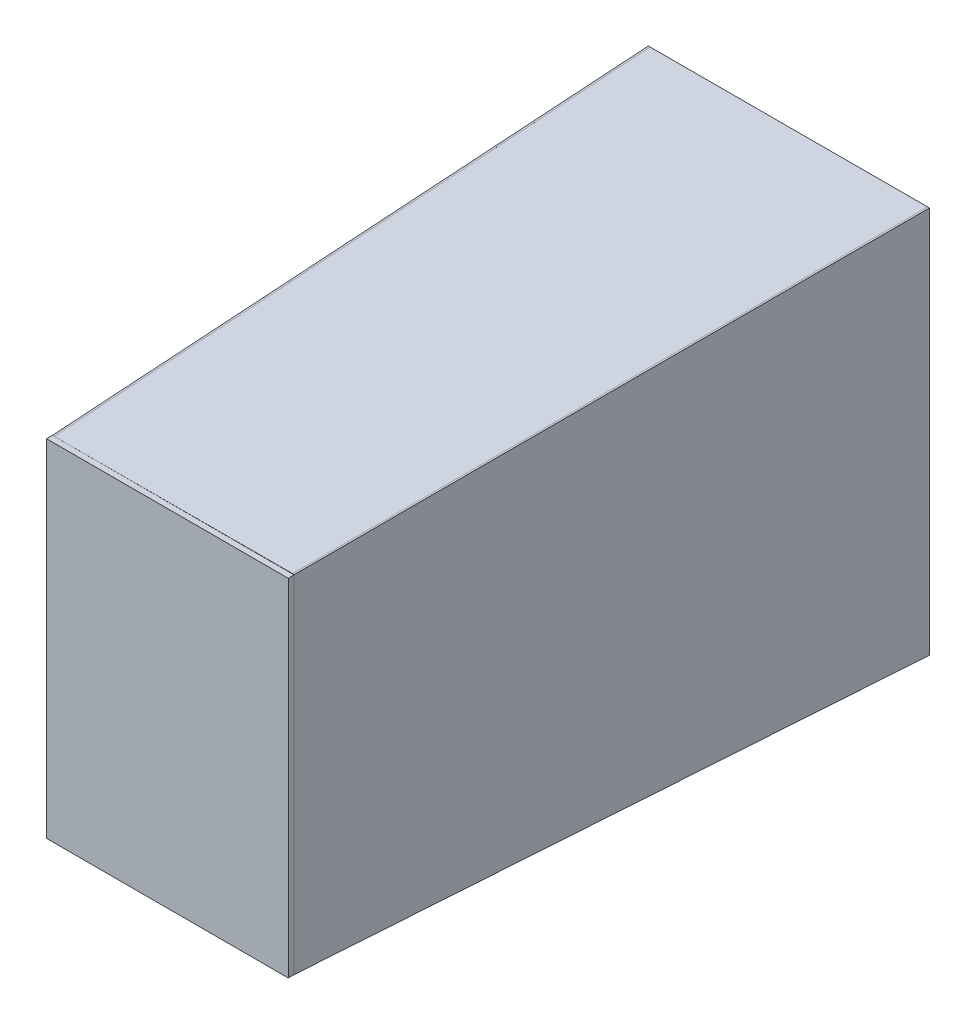
ISO-10303-21;
HEADER;
FILE_DESCRIPTION(('STEP AP214'),'2;1');
FILE_NAME('part.step','',(''),(''),'','','');
FILE_SCHEMA(('AUTOMOTIVE_DESIGN { 1 0 10303 214 1 1 1 1 }'));
ENDSEC;
DATA;
#1=APPLICATION_CONTEXT('core data for automotive mechanical design processes');
#2=APPLICATION_PROTOCOL_DEFINITION('international standard','automotive_design',2000,#1);
#3=PRODUCT_CONTEXT('',#1,'mechanical');
#4=PRODUCT('Part','Part','',(#3));
#5=PRODUCT_RELATED_PRODUCT_CATEGORY('part','',(#4));
#6=PRODUCT_DEFINITION_FORMATION('','',#4);
#7=PRODUCT_DEFINITION_CONTEXT('part definition',#1,'design');
#8=PRODUCT_DEFINITION('design','',#6,#7);
#9=PRODUCT_DEFINITION_SHAPE('','',#8);
#10=(LENGTH_UNIT() NAMED_UNIT(*) SI_UNIT(.MILLI.,.METRE.));
#11=(NAMED_UNIT(*) PLANE_ANGLE_UNIT() SI_UNIT($,.RADIAN.));
#12=(NAMED_UNIT(*) SI_UNIT($,.STERADIAN.) SOLID_ANGLE_UNIT());
#13=UNCERTAINTY_MEASURE_WITH_UNIT(LENGTH_MEASURE(1.E-05),#10,'distance_accuracy_value','');
#14=(GEOMETRIC_REPRESENTATION_CONTEXT(3) GLOBAL_UNCERTAINTY_ASSIGNED_CONTEXT((#13)) GLOBAL_UNIT_ASSIGNED_CONTEXT((#10,
#11,#12)) REPRESENTATION_CONTEXT('',''));
#15=CARTESIAN_POINT('',(0.,0.,0.));
#16=DIRECTION('',(0.,0.,1.));
#17=DIRECTION('',(1.,0.,0.));
#18=AXIS2_PLACEMENT_3D('',#15,#16,#17);
#19=CARTESIAN_POINT('',(-17.5132630813953,-339.725,-547.6875));
#20=DIRECTION('',(0.999489135656021,0.,-0.0319604084076053));
#21=DIRECTION('',(-0.0319604084076053,0.,-0.999489135656021));
#22=AXIS2_PLACEMENT_3D('',#19,#20,#21);
#23=PLANE('',#22);
#24=DIRECTION('',(-0.031944351275446,0.0316948188265588,-0.998986985341222));
#25=VECTOR('',#24,1.);
#26=CARTESIAN_POINT('',(-17.1711627874103,-2.17772519514731,-536.989090806285));
#27=LINE('',#26,#25);
#28=CARTESIAN_POINT('',(-0.186808139534887,-19.029407009209,-5.84200000000001));
#29=VERTEX_POINT('',#28);
#30=CARTESIAN_POINT('',(-17.5132630813954,-1.83829720849408,-547.6875));
#31=VERTEX_POINT('',#30);
#32=EDGE_CURVE('E318',#29,#31,#27,.T.);
#33=ORIENTED_EDGE('',*,*,#32,.F.);
#34=DIRECTION('',(0.,-1.,0.));
#35=VECTOR('',#34,1.);
#36=CARTESIAN_POINT('',(-0.186808139534887,-339.725,-5.84200000000001));
#37=LINE('',#36,#35);
#38=CARTESIAN_POINT('',(-0.186808139534823,-322.283894232377,-5.84200000000012));
#39=VERTEX_POINT('',#38);
#40=EDGE_CURVE('E203',#29,#39,#37,.T.);
#41=ORIENTED_EDGE('',*,*,#40,.T.);
#42=DIRECTION('',(0.031944351275446,0.0316948188265588,0.998986985341222));
#43=VECTOR('',#42,1.);
#44=CARTESIAN_POINT('',(-17.5135161949185,-339.475255169426,-547.695415550179));
#45=LINE('',#44,#43);
#46=CARTESIAN_POINT('',(-17.5132630813953,-339.475004033092,-547.6875));
#47=VERTEX_POINT('',#46);
#48=EDGE_CURVE('E320',#47,#39,#45,.T.);
#49=ORIENTED_EDGE('',*,*,#48,.F.);
#50=DIRECTION('',(0.,1.,0.));
#51=VECTOR('',#50,1.);
#52=CARTESIAN_POINT('',(-17.5132630813953,-339.725,-547.6875));
#53=LINE('',#52,#51);
#54=EDGE_CURVE('E276',#47,#31,#53,.T.);
#55=ORIENTED_EDGE('',*,*,#54,.T.);
#56=EDGE_LOOP('',(#33,#41,#49,#55));
#57=FACE_BOUND('',#56,.T.);
#58=ADVANCED_FACE('F39',(#57),#23,.T.);
#59=CARTESIAN_POINT('',(227.063263081395,-339.725,-547.6875));
#60=DIRECTION('',(-0.999489135656021,0.,-0.0319604084076053));
#61=DIRECTION('',(-0.0319604084076053,0.,0.999489135656021));
#62=AXIS2_PLACEMENT_3D('',#59,#60,#61);
#63=PLANE('',#62);
#64=DIRECTION('',(0.0319442855162709,-0.0317596364670438,-0.998984928872471));
#65=VECTOR('',#64,1.);
#66=CARTESIAN_POINT('',(227.063264717878,-339.723388596295,-547.687551177268));
#67=LINE('',#66,#65);
#68=CARTESIAN_POINT('',(209.736808139535,-322.497084946151,-5.84200000000006));
#69=VERTEX_POINT('',#68);
#70=CARTESIAN_POINT('',(227.063263081395,-339.723386969272,-547.6875));
#71=VERTEX_POINT('',#70);
#72=EDGE_CURVE('E329',#69,#71,#67,.T.);
#73=ORIENTED_EDGE('',*,*,#72,.F.);
#74=DIRECTION('',(0.,1.,0.));
#75=VECTOR('',#74,1.);
#76=CARTESIAN_POINT('',(209.736808139535,-339.725,-5.84200000000001));
#77=LINE('',#76,#75);
#78=CARTESIAN_POINT('',(209.736808139535,-18.8162162954352,-5.84200000000001));
#79=VERTEX_POINT('',#78);
#80=EDGE_CURVE('E55',#69,#79,#77,.T.);
#81=ORIENTED_EDGE('',*,*,#80,.T.);
#82=DIRECTION('',(-0.0319442855162709,-0.0317596364670438,0.998984928872471));
#83=VECTOR('',#82,1.);
#84=CARTESIAN_POINT('',(226.720211885094,-1.9309825137232,-536.959353497488));
#85=LINE('',#84,#83);
#86=CARTESIAN_POINT('',(227.063263081395,-1.58991427231389,-547.6875));
#87=VERTEX_POINT('',#86);
#88=EDGE_CURVE('E287',#87,#79,#85,.T.);
#89=ORIENTED_EDGE('',*,*,#88,.F.);
#90=DIRECTION('',(0.,1.,0.));
#91=VECTOR('',#90,1.);
#92=CARTESIAN_POINT('',(227.063263081395,-339.725,-547.6875));
#93=LINE('',#92,#91);
#94=EDGE_CURVE('E301',#71,#87,#93,.T.);
#95=ORIENTED_EDGE('',*,*,#94,.F.);
#96=EDGE_LOOP('',(#73,#81,#89,#95));
#97=FACE_BOUND('',#96,.T.);
#98=ADVANCED_FACE('F390',(#97),#63,.T.);
#99=CARTESIAN_POINT('',(-569.503066199174,-19.0491991626118,-23.423690587868));
#100=DIRECTION('',(0.0010150509523638,-0.999495535503526,-0.0317434116011951));
#101=DIRECTION('',(0.,0.0317434279542775,-0.99949605040826));
#102=AXIS2_PLACEMENT_3D('',#99,#100,#101);
#103=PLANE('',#102);
#104=ORIENTED_EDGE('',*,*,#88,.T.);
#105=DIRECTION('',(-0.999999484316023,-0.00101556274426671,0.));
#106=VECTOR('',#105,1.);
#107=CARTESIAN_POINT('',(-569.502499124945,-19.6075831128565,-5.842));
#108=LINE('',#107,#106);
#109=EDGE_CURVE('E207',#79,#29,#108,.T.);
#110=ORIENTED_EDGE('',*,*,#109,.T.);
#111=ORIENTED_EDGE('',*,*,#32,.T.);
#112=DIRECTION('',(-0.999999484316023,-0.00101556274426671,0.));
#113=VECTOR('',#112,1.);
#114=CARTESIAN_POINT('',(-569.519975636533,-2.39889494944152,-547.6875));
#115=LINE('',#114,#113);
#116=EDGE_CURVE('E247',#87,#31,#115,.T.);
#117=ORIENTED_EDGE('',*,*,#116,.F.);
#118=EDGE_LOOP('',(#104,#110,#111,#117));
#119=FACE_BOUND('',#118,.T.);
#120=ADVANCED_FACE('F327',(#119),#103,.T.);
#121=CARTESIAN_POINT('',(-569.504677592561,-322.2625,-23.3732979219511));
#122=DIRECTION('',(0.0010150509523638,0.999495535503526,-0.0317434116011951));
#123=DIRECTION('',(0.,0.0317434279542775,0.99949605040826));
#124=AXIS2_PLACEMENT_3D('',#121,#122,#123);
#125=PLANE('',#124);
#126=ORIENTED_EDGE('',*,*,#48,.T.);
#127=DIRECTION('',(0.999999484316023,-0.00101556274426671,0.));
#128=VECTOR('',#127,1.);
#129=CARTESIAN_POINT('',(-569.50411214368,-321.705716490607,-5.842));
#130=LINE('',#129,#128);
#131=EDGE_CURVE('E198',#39,#69,#130,.T.);
#132=ORIENTED_EDGE('',*,*,#131,.T.);
#133=ORIENTED_EDGE('',*,*,#72,.T.);
#134=DIRECTION('',(0.999999484316023,-0.00101556274426671,0.));
#135=VECTOR('',#134,1.);
#136=CARTESIAN_POINT('',(-569.521588655269,-338.914404654022,-547.6875));
#137=LINE('',#136,#135);
#138=EDGE_CURVE('E244',#47,#71,#137,.T.);
#139=ORIENTED_EDGE('',*,*,#138,.F.);
#140=EDGE_LOOP('',(#126,#132,#133,#139));
#141=FACE_BOUND('',#140,.T.);
#142=ADVANCED_FACE('F398',(#141),#125,.T.);
#143=DIRECTION('',(0.,-1.,0.));
#144=VECTOR('',#143,1.);
#145=CARTESIAN_POINT('',(209.716871201022,-339.725,-5.21851755922265));
#146=LINE('',#145,#144);
#147=CARTESIAN_POINT('',(209.716871201022,-17.2464126255132,-5.21851755922265));
#148=VERTEX_POINT('',#147);
#149=CARTESIAN_POINT('',(209.716871201022,-17.2477367499432,-5.21851755922275));
#150=VERTEX_POINT('',#149);
#151=EDGE_CURVE('E225',#148,#150,#146,.T.);
#152=ORIENTED_EDGE('',*,*,#151,.F.);
#153=DIRECTION('',(-0.0319442879898414,-0.0317572007099635,0.998985006227766));
#154=VECTOR('',#153,1.);
#155=CARTESIAN_POINT('',(226.718626898269,-0.34423066825845,-536.909786636773));
#156=LINE('',#155,#154);
#157=CARTESIAN_POINT('',(227.063263081395,-0.00161290689395263,-547.6875));
#158=VERTEX_POINT('',#157);
#159=EDGE_CURVE('E268',#158,#148,#156,.T.);
#160=ORIENTED_EDGE('',*,*,#159,.F.);
#161=DIRECTION('',(0.0319442855162709,0.0317596364670438,-0.998984928872471));
#162=VECTOR('',#161,1.);
#163=CARTESIAN_POINT('',(226.718600491707,-0.344283351111307,-536.908960831572));
#164=LINE('',#163,#162);
#165=EDGE_CURVE('E297',#150,#158,#164,.T.);
#166=ORIENTED_EDGE('',*,*,#165,.F.);
#167=EDGE_LOOP('',(#152,#160,#166));
#168=FACE_BOUND('',#167,.T.);
#169=ADVANCED_FACE('F345',(#168),#63,.T.);
#170=DIRECTION('',(0.,1.,0.));
#171=VECTOR('',#170,1.);
#172=CARTESIAN_POINT('',(-0.166871201021657,-339.725,-5.21851755922265));
#173=LINE('',#172,#171);
#174=CARTESIAN_POINT('',(-0.166871201021658,-17.4608869692721,-5.2185175592227));
#175=VERTEX_POINT('',#174);
#176=CARTESIAN_POINT('',(-0.166871201021657,-17.4595464811061,-5.21851755922265));
#177=VERTEX_POINT('',#176);
#178=EDGE_CURVE('E219',#175,#177,#173,.T.);
#179=ORIENTED_EDGE('',*,*,#178,.F.);
#180=DIRECTION('',(0.031944351275446,-0.0316948188265588,0.998986985341222));
#181=VECTOR('',#180,1.);
#182=CARTESIAN_POINT('',(-17.1695546793752,-0.591019499903145,-536.938800882281));
#183=LINE('',#182,#181);
#184=CARTESIAN_POINT('',(-17.5132630814167,-0.249986370699172,-547.6875));
#185=VERTEX_POINT('',#184);
#186=EDGE_CURVE('E281',#185,#175,#183,.T.);
#187=ORIENTED_EDGE('',*,*,#186,.F.);
#188=DIRECTION('',(-0.0319443537389353,0.0316923880305622,-0.998987062381251));
#189=VECTOR('',#188,1.);
#190=CARTESIAN_POINT('',(-17.1695809937432,-0.590948019989379,-536.939623804334));
#191=LINE('',#190,#189);
#192=EDGE_CURVE('E271',#177,#185,#191,.T.);
#193=ORIENTED_EDGE('',*,*,#192,.F.);
#194=EDGE_LOOP('',(#179,#187,#193));
#195=FACE_BOUND('',#194,.T.);
#196=ADVANCED_FACE('F41',(#195),#23,.T.);
#197=CARTESIAN_POINT('',(228.651574493063,-339.725,-547.6875));
#198=DIRECTION('',(0.,0.,-1.));
#199=DIRECTION('',(-1.,0.,0.));
#200=AXIS2_PLACEMENT_3D('',#197,#198,#199);
#201=PLANE('',#200);
#202=ORIENTED_EDGE('',*,*,#94,.T.);
#203=ORIENTED_EDGE('',*,*,#116,.T.);
#204=ORIENTED_EDGE('',*,*,#54,.F.);
#205=ORIENTED_EDGE('',*,*,#138,.T.);
#206=EDGE_LOOP('',(#202,#203,#204,#205));
#207=FACE_BOUND('',#206,.T.);
#208=DIRECTION('',(0.,1.,0.));
#209=VECTOR('',#208,1.);
#210=CARTESIAN_POINT('',(228.651574493063,-339.725,-547.6875));
#211=LINE('',#210,#209);
#212=CARTESIAN_POINT('',(228.651574493063,-341.313301241586,-547.687500000001));
#213=VERTEX_POINT('',#212);
#214=CARTESIAN_POINT('',(228.651574489838,-1.641129723437E-12,-547.6875));
#215=VERTEX_POINT('',#214);
#216=EDGE_CURVE('E305',#213,#215,#211,.T.);
#217=ORIENTED_EDGE('',*,*,#216,.F.);
#218=DIRECTION('',(0.999999386328291,-0.00110785515350718,0.));
#219=VECTOR('',#218,1.);
#220=CARTESIAN_POINT('',(-36.9399686480514,-341.019064101224,-547.6875));
#221=LINE('',#220,#219);
#222=CARTESIAN_POINT('',(-19.1015744930627,-341.038826470247,-547.6875));
#223=VERTEX_POINT('',#222);
#224=EDGE_CURVE('E237',#223,#213,#221,.T.);
#225=ORIENTED_EDGE('',*,*,#224,.F.);
#226=DIRECTION('',(0.,1.,0.));
#227=VECTOR('',#226,1.);
#228=CARTESIAN_POINT('',(-19.1015744930627,-339.725,-547.6875));
#229=LINE('',#228,#227);
#230=CARTESIAN_POINT('',(-19.1015744930627,-0.251589681384326,-547.6875));
#231=VERTEX_POINT('',#230);
#232=EDGE_CURVE('E307',#223,#231,#229,.T.);
#233=ORIENTED_EDGE('',*,*,#232,.T.);
#234=DIRECTION('',(-0.999999484395199,-0.00101548477867201,0.));
#235=VECTOR('',#234,1.);
#236=CARTESIAN_POINT('',(-17.5132630911401,-0.249976774500255,-547.6875));
#237=LINE('',#236,#235);
#238=EDGE_CURVE('E288',#185,#231,#237,.T.);
#239=ORIENTED_EDGE('',*,*,#238,.F.);
#240=DIRECTION('',(0.999999484316023,0.00101556274426671,0.));
#241=VECTOR('',#240,1.);
#242=CARTESIAN_POINT('',(-569.520238868653,-0.8105939751843,-547.6875));
#243=LINE('',#242,#241);
#244=EDGE_CURVE('E241',#185,#158,#243,.T.);
#245=ORIENTED_EDGE('',*,*,#244,.T.);
#246=DIRECTION('',(0.999999484316023,0.00101556274426671,0.));
#247=VECTOR('',#246,1.);
#248=CARTESIAN_POINT('',(228.306562617684,-0.000350381387570486,-547.6875));
#249=LINE('',#248,#247);
#250=EDGE_CURVE('E286',#158,#215,#249,.T.);
#251=ORIENTED_EDGE('',*,*,#250,.T.);
#252=EDGE_LOOP('',(#217,#225,#233,#239,#245,#251));
#253=FACE_BOUND('',#252,.T.);
#254=ADVANCED_FACE('F322',(#207,#253),#201,.T.);
#255=CARTESIAN_POINT('',(228.651574493063,-339.725,-547.6875));
#256=DIRECTION('',(0.999489135656021,0.,0.0319604084076054));
#257=DIRECTION('',(0.0319604084076054,0.,-0.999489135656021));
#258=AXIS2_PLACEMENT_3D('',#255,#256,#257);
#259=PLANE('',#258);
#260=DIRECTION('',(0.,1.,0.));
#261=VECTOR('',#260,1.);
#262=CARTESIAN_POINT('',(211.305182612689,-339.725,-5.21851755922265));
#263=LINE('',#262,#261);
#264=CARTESIAN_POINT('',(211.305182612689,-322.499880780474,-5.21851755922264));
#265=VERTEX_POINT('',#264);
#266=CARTESIAN_POINT('',(211.305182612689,-17.461159388,-5.21851755922263));
#267=VERTEX_POINT('',#266);
#268=EDGE_CURVE('E233',#265,#267,#263,.T.);
#269=ORIENTED_EDGE('',*,*,#268,.F.);
#270=DIRECTION('',(-0.0319412246787668,0.0346425754744067,0.998889208135978));
#271=VECTOR('',#270,1.);
#272=CARTESIAN_POINT('',(211.087548330272,-322.263840612,1.5875));
#273=LINE('',#272,#271);
#274=EDGE_CURVE('E251',#213,#265,#273,.T.);
#275=ORIENTED_EDGE('',*,*,#274,.F.);
#276=ORIENTED_EDGE('',*,*,#216,.T.);
#277=DIRECTION('',(0.0319442879898414,0.0317572007099635,-0.998985006227766));
#278=VECTOR('',#277,1.);
#279=CARTESIAN_POINT('',(228.651574493063,0.,-547.6875));
#280=LINE('',#279,#278);
#281=CARTESIAN_POINT('',(211.305182612689,-17.2447997186192,-5.2185175592227));
#282=VERTEX_POINT('',#281);
#283=EDGE_CURVE('E255',#282,#215,#280,.T.);
#284=ORIENTED_EDGE('',*,*,#283,.F.);
#285=EDGE_CURVE('E232',#267,#282,#263,.T.);
#286=ORIENTED_EDGE('',*,*,#285,.F.);
#287=EDGE_LOOP('',(#269,#275,#276,#284,#286));
#288=FACE_BOUND('',#287,.T.);
#289=ADVANCED_FACE('F376',(#288),#259,.T.);
#290=CARTESIAN_POINT('',(-19.1015744930627,-339.725,-547.6875));
#291=DIRECTION('',(-0.999489135656021,0.,0.0319604084076053));
#292=DIRECTION('',(0.0319604084076053,0.,0.999489135656021));
#293=AXIS2_PLACEMENT_3D('',#290,#291,#292);
#294=PLANE('',#293);
#295=DIRECTION('',(0.,1.,0.));
#296=VECTOR('',#295,1.);
#297=CARTESIAN_POINT('',(-1.75518261268901,-341.313301241586,-5.21851755922263));
#298=LINE('',#297,#296);
#299=CARTESIAN_POINT('',(-1.75518261268901,-322.263840612,-5.21851755922263));
#300=VERTEX_POINT('',#299);
#301=CARTESIAN_POINT('',(-1.75518261268901,-17.461159388,-5.21851755922263));
#302=VERTEX_POINT('',#301);
#303=EDGE_CURVE('E211',#300,#302,#298,.T.);
#304=ORIENTED_EDGE('',*,*,#303,.T.);
#305=DIRECTION('',(0.0319443537389354,-0.0316923880305622,0.998987062381251));
#306=VECTOR('',#305,1.);
#307=CARTESIAN_POINT('',(-18.757894038306,-0.592559306867579,-536.939674869427));
#308=LINE('',#307,#306);
#309=EDGE_CURVE('E265',#231,#302,#308,.T.);
#310=ORIENTED_EDGE('',*,*,#309,.F.);
#311=ORIENTED_EDGE('',*,*,#232,.F.);
#312=DIRECTION('',(-0.0319413029107418,-0.0345718876051493,-0.998891654663198));
#313=VECTOR('',#312,1.);
#314=CARTESIAN_POINT('',(-19.1001236724163,-341.0372561646,-547.642128881603));
#315=LINE('',#314,#313);
#316=EDGE_CURVE('E259',#300,#223,#315,.T.);
#317=ORIENTED_EDGE('',*,*,#316,.F.);
#318=EDGE_LOOP('',(#304,#310,#311,#317));
#319=FACE_BOUND('',#318,.T.);
#320=ADVANCED_FACE('F386',(#319),#294,.T.);
#321=CARTESIAN_POINT('',(-569.50332916605,-17.4611593678618,-23.4154668964809));
#322=DIRECTION('',(-0.0010150509523638,0.999495535503526,0.0317434116011951));
#323=DIRECTION('',(0.,-0.0317434279542775,0.99949605040826));
#324=AXIS2_PLACEMENT_3D('',#321,#322,#323);
#325=PLANE('',#324);
#326=DIRECTION('',(-0.999999484316023,-0.00101556274426671,0.));
#327=VECTOR('',#326,1.);
#328=CARTESIAN_POINT('',(-569.502742247461,-18.0390835670483,-5.21851755922263));
#329=LINE('',#328,#327);
#330=EDGE_CURVE('E222',#150,#175,#329,.T.);
#331=ORIENTED_EDGE('',*,*,#330,.F.);
#332=ORIENTED_EDGE('',*,*,#165,.T.);
#333=ORIENTED_EDGE('',*,*,#244,.F.);
#334=ORIENTED_EDGE('',*,*,#186,.T.);
#335=EDGE_LOOP('',(#331,#332,#333,#334));
#336=FACE_BOUND('',#335,.T.);
#337=ADVANCED_FACE('F351',(#336),#325,.T.);
#338=CARTESIAN_POINT('',(-36.9191905643028,-322.263840612,-6.34294804604747));
#339=DIRECTION('',(0.00110719086045333,0.999399765841728,-0.0346248778178132));
#340=DIRECTION('',(0.,0.0346248990406599,0.999400378410186));
#341=AXIS2_PLACEMENT_3D('',#338,#339,#340);
#342=PLANE('',#341);
#343=DIRECTION('',(0.999999386328291,-0.00110785515350718,0.));
#344=VECTOR('',#343,1.);
#345=CARTESIAN_POINT('',(-36.9191713367324,-322.24648495094,-5.842));
#346=LINE('',#345,#344);
#347=CARTESIAN_POINT('',(-1.755182612689,-322.285441580973,-5.842));
#348=VERTEX_POINT('',#347);
#349=CARTESIAN_POINT('',(191.807186282896,-322.499880780474,-5.842));
#350=VERTEX_POINT('',#349);
#351=EDGE_CURVE('E11',#348,#350,#346,.T.);
#352=ORIENTED_EDGE('',*,*,#351,.F.);
#353=DIRECTION('',(0.,0.0346248990406599,0.999400378410186));
#354=VECTOR('',#353,1.);
#355=CARTESIAN_POINT('',(-1.755182612689,-322.302750558842,-6.34159998473972));
#356=LINE('',#355,#354);
#357=EDGE_CURVE('E154',#348,#300,#356,.T.);
#358=ORIENTED_EDGE('',*,*,#357,.T.);
#359=ORIENTED_EDGE('',*,*,#316,.T.);
#360=ORIENTED_EDGE('',*,*,#224,.T.);
#361=ORIENTED_EDGE('',*,*,#274,.T.);
#362=DIRECTION('',(-0.999489135656021,0.,-0.0319604084076054));
#363=VECTOR('',#362,1.);
#364=CARTESIAN_POINT('',(-36.7015562818858,-322.499880780474,-13.14896560527));
#365=LINE('',#364,#363);
#366=EDGE_CURVE('E63',#265,#350,#365,.T.);
#367=ORIENTED_EDGE('',*,*,#366,.T.);
#368=EDGE_LOOP('',(#352,#358,#359,#360,#361,#367));
#369=FACE_BOUND('',#368,.T.);
#370=ADVANCED_FACE('F377',(#369),#342,.F.);
#371=CARTESIAN_POINT('',(-19.3551644015121,0.,-555.617948046048));
#372=DIRECTION('',(0.00101497310457273,-0.999495612898359,-0.0317409770884561));
#373=DIRECTION('',(0.,0.0317409934377763,-0.999496127724156));
#374=AXIS2_PLACEMENT_3D('',#371,#372,#373);
#375=PLANE('',#374);
#376=ORIENTED_EDGE('',*,*,#159,.T.);
#377=DIRECTION('',(0.999999484395199,0.001015484778672,0.));
#378=VECTOR('',#377,1.);
#379=CARTESIAN_POINT('',(-19.3374147198125,-17.4790138862857,-5.21851755922265));
#380=LINE('',#379,#378);
#381=EDGE_CURVE('E228',#148,#282,#380,.T.);
#382=ORIENTED_EDGE('',*,*,#381,.T.);
#383=ORIENTED_EDGE('',*,*,#283,.T.);
#384=ORIENTED_EDGE('',*,*,#250,.F.);
#385=EDGE_LOOP('',(#376,#382,#383,#384));
#386=FACE_BOUND('',#385,.T.);
#387=ADVANCED_FACE('F340',(#386),#375,.F.);
#388=ORIENTED_EDGE('',*,*,#309,.T.);
#389=DIRECTION('',(0.999999484395199,0.001015484778672,0.));
#390=VECTOR('',#389,1.);
#391=CARTESIAN_POINT('',(-19.3374147198125,-17.4790138862857,-5.21851755922265));
#392=LINE('',#391,#390);
#393=EDGE_CURVE('E215',#302,#177,#392,.T.);
#394=ORIENTED_EDGE('',*,*,#393,.T.);
#395=ORIENTED_EDGE('',*,*,#192,.T.);
#396=ORIENTED_EDGE('',*,*,#238,.T.);
#397=EDGE_LOOP('',(#388,#394,#395,#396));
#398=FACE_BOUND('',#397,.T.);
#399=ADVANCED_FACE('F358',(#398),#375,.F.);
#400=CARTESIAN_POINT('',(-1.75518261268901,-341.313301241586,-5.21851755922263));
#401=DIRECTION('',(0.,0.,-1.));
#402=DIRECTION('',(-1.,0.,0.));
#403=AXIS2_PLACEMENT_3D('',#400,#401,#402);
#404=PLANE('',#403);
#405=ORIENTED_EDGE('',*,*,#393,.F.);
#406=DIRECTION('',(1.,0.,0.));
#407=VECTOR('',#406,1.);
#408=CARTESIAN_POINT('',(-1.75518261268901,-17.461159388,-5.21851755922263));
#409=LINE('',#408,#407);
#410=EDGE_CURVE('E48',#302,#267,#409,.T.);
#411=ORIENTED_EDGE('',*,*,#410,.T.);
#412=ORIENTED_EDGE('',*,*,#285,.T.);
#413=ORIENTED_EDGE('',*,*,#381,.F.);
#414=ORIENTED_EDGE('',*,*,#151,.T.);
#415=ORIENTED_EDGE('',*,*,#330,.T.);
#416=ORIENTED_EDGE('',*,*,#178,.T.);
#417=EDGE_LOOP('',(#405,#411,#412,#413,#414,#415,#416));
#418=FACE_BOUND('',#417,.T.);
#419=ADVANCED_FACE('F348',(#418),#404,.F.);
#420=CARTESIAN_POINT('',(0.,0.,0.));
#421=DIRECTION('',(0.,0.,1.));
#422=DIRECTION('',(1.,0.,0.));
#423=AXIS2_PLACEMENT_3D('',#420,#421,#422);
#424=PLANE('',#423);
#425=DIRECTION('',(0.,-1.,0.));
#426=VECTOR('',#425,1.);
#427=CARTESIAN_POINT('',(-1.75518261268901,-17.461159388,0.));
#428=LINE('',#427,#426);
#429=CARTESIAN_POINT('',(-1.75518261268901,-17.461159388,0.));
#430=VERTEX_POINT('',#429);
#431=CARTESIAN_POINT('',(-1.75518261268901,-322.499880780474,0.));
#432=VERTEX_POINT('',#431);
#433=EDGE_CURVE('E174',#430,#432,#428,.T.);
#434=ORIENTED_EDGE('',*,*,#433,.T.);
#435=DIRECTION('',(1.,0.,0.));
#436=VECTOR('',#435,1.);
#437=CARTESIAN_POINT('',(-1.75518261268901,-322.499880780474,0.));
#438=LINE('',#437,#436);
#439=CARTESIAN_POINT('',(211.305182612689,-322.499880780474,0.));
#440=VERTEX_POINT('',#439);
#441=EDGE_CURVE('E165',#432,#440,#438,.T.);
#442=ORIENTED_EDGE('',*,*,#441,.T.);
#443=DIRECTION('',(0.,1.,0.));
#444=VECTOR('',#443,1.);
#445=CARTESIAN_POINT('',(211.305182612689,-17.461159388,0.));
#446=LINE('',#445,#444);
#447=CARTESIAN_POINT('',(211.305182612689,-17.461159388,0.));
#448=VERTEX_POINT('',#447);
#449=EDGE_CURVE('E179',#440,#448,#446,.T.);
#450=ORIENTED_EDGE('',*,*,#449,.T.);
#451=DIRECTION('',(-1.,0.,0.));
#452=VECTOR('',#451,1.);
#453=CARTESIAN_POINT('',(-1.75518261268901,-17.461159388,0.));
#454=LINE('',#453,#452);
#455=EDGE_CURVE('E159',#448,#430,#454,.T.);
#456=ORIENTED_EDGE('',*,*,#455,.T.);
#457=EDGE_LOOP('',(#434,#442,#450,#456));
#458=FACE_BOUND('',#457,.T.);
#459=ADVANCED_FACE('F369',(#458),#424,.T.);
#460=CARTESIAN_POINT('',(-1.75518261268901,-322.499880780474,-5.842));
#461=DIRECTION('',(0.,-1.,0.));
#462=DIRECTION('',(0.,0.,-1.));
#463=AXIS2_PLACEMENT_3D('',#460,#461,#462);
#464=PLANE('',#463);
#465=ORIENTED_EDGE('',*,*,#366,.F.);
#466=DIRECTION('',(0.,0.,1.));
#467=VECTOR('',#466,1.);
#468=CARTESIAN_POINT('',(211.305182612689,-322.499880780474,-5.842));
#469=LINE('',#468,#467);
#470=EDGE_CURVE('E168',#265,#440,#469,.T.);
#471=ORIENTED_EDGE('',*,*,#470,.T.);
#472=ORIENTED_EDGE('',*,*,#441,.F.);
#473=DIRECTION('',(0.,0.,1.));
#474=VECTOR('',#473,1.);
#475=CARTESIAN_POINT('',(-1.75518261268901,-322.499880780474,-5.842));
#476=LINE('',#475,#474);
#477=CARTESIAN_POINT('',(-1.75518261268901,-322.499880780474,-5.842));
#478=VERTEX_POINT('',#477);
#479=EDGE_CURVE('E151',#478,#432,#476,.T.);
#480=ORIENTED_EDGE('',*,*,#479,.F.);
#481=DIRECTION('',(1.,0.,0.));
#482=VECTOR('',#481,1.);
#483=CARTESIAN_POINT('',(-1.75518261268901,-322.499880780474,-5.842));
#484=LINE('',#483,#482);
#485=EDGE_CURVE('E158',#478,#350,#484,.T.);
#486=ORIENTED_EDGE('',*,*,#485,.T.);
#487=EDGE_LOOP('',(#465,#471,#472,#480,#486));
#488=FACE_BOUND('',#487,.T.);
#489=ADVANCED_FACE('F163',(#488),#464,.T.);
#490=CARTESIAN_POINT('',(211.305182612689,-17.461159388,-5.842));
#491=DIRECTION('',(1.,0.,0.));
#492=DIRECTION('',(0.,0.,-1.));
#493=AXIS2_PLACEMENT_3D('',#490,#491,#492);
#494=PLANE('',#493);
#495=ORIENTED_EDGE('',*,*,#268,.T.);
#496=DIRECTION('',(0.,0.,1.));
#497=VECTOR('',#496,1.);
#498=CARTESIAN_POINT('',(211.305182612689,-17.461159388,-5.842));
#499=LINE('',#498,#497);
#500=EDGE_CURVE('E189',#267,#448,#499,.T.);
#501=ORIENTED_EDGE('',*,*,#500,.T.);
#502=ORIENTED_EDGE('',*,*,#449,.F.);
#503=ORIENTED_EDGE('',*,*,#470,.F.);
#504=EDGE_LOOP('',(#495,#501,#502,#503));
#505=FACE_BOUND('',#504,.T.);
#506=ADVANCED_FACE('F373',(#505),#494,.T.);
#507=CARTESIAN_POINT('',(-1.75518261268901,-17.461159388,-5.842));
#508=DIRECTION('',(0.,1.,0.));
#509=DIRECTION('',(0.,0.,1.));
#510=AXIS2_PLACEMENT_3D('',#507,#508,#509);
#511=PLANE('',#510);
#512=ORIENTED_EDGE('',*,*,#410,.F.);
#513=DIRECTION('',(0.,0.,1.));
#514=VECTOR('',#513,1.);
#515=CARTESIAN_POINT('',(-1.75518261268901,-17.461159388,-5.842));
#516=LINE('',#515,#514);
#517=EDGE_CURVE('E186',#302,#430,#516,.T.);
#518=ORIENTED_EDGE('',*,*,#517,.T.);
#519=ORIENTED_EDGE('',*,*,#455,.F.);
#520=ORIENTED_EDGE('',*,*,#500,.F.);
#521=EDGE_LOOP('',(#512,#518,#519,#520));
#522=FACE_BOUND('',#521,.T.);
#523=ADVANCED_FACE('F365',(#522),#511,.T.);
#524=CARTESIAN_POINT('',(-1.75518261268901,-17.461159388,-5.842));
#525=DIRECTION('',(-1.,0.,0.));
#526=DIRECTION('',(0.,0.,1.));
#527=AXIS2_PLACEMENT_3D('',#524,#525,#526);
#528=PLANE('',#527);
#529=ORIENTED_EDGE('',*,*,#357,.F.);
#530=DIRECTION('',(0.,-1.,0.));
#531=VECTOR('',#530,1.);
#532=CARTESIAN_POINT('',(-1.75518261268901,-17.461159388,-5.842));
#533=LINE('',#532,#531);
#534=EDGE_CURVE('E147',#348,#478,#533,.T.);
#535=ORIENTED_EDGE('',*,*,#534,.T.);
#536=ORIENTED_EDGE('',*,*,#479,.T.);
#537=ORIENTED_EDGE('',*,*,#433,.F.);
#538=ORIENTED_EDGE('',*,*,#517,.F.);
#539=ORIENTED_EDGE('',*,*,#303,.F.);
#540=EDGE_LOOP('',(#529,#535,#536,#537,#538,#539));
#541=FACE_BOUND('',#540,.T.);
#542=ADVANCED_FACE('F149',(#541),#528,.T.);
#543=CARTESIAN_POINT('',(0.,0.,-5.842));
#544=DIRECTION('',(0.,0.,1.));
#545=DIRECTION('',(1.,0.,0.));
#546=AXIS2_PLACEMENT_3D('',#543,#544,#545);
#547=PLANE('',#546);
#548=ORIENTED_EDGE('',*,*,#534,.F.);
#549=ORIENTED_EDGE('',*,*,#351,.T.);
#550=ORIENTED_EDGE('',*,*,#485,.F.);
#551=EDGE_LOOP('',(#548,#549,#550));
#552=FACE_BOUND('',#551,.T.);
#553=ADVANCED_FACE('F170',(#552),#547,.F.);
#554=ORIENTED_EDGE('',*,*,#109,.F.);
#555=ORIENTED_EDGE('',*,*,#80,.F.);
#556=ORIENTED_EDGE('',*,*,#131,.F.);
#557=ORIENTED_EDGE('',*,*,#40,.F.);
#558=EDGE_LOOP('',(#554,#555,#556,#557));
#559=FACE_BOUND('',#558,.T.);
#560=ADVANCED_FACE('F547',(#559),#547,.F.);
#561=CLOSED_SHELL('',(#58,#98,#120,#142,#169,#196,#254,#289,#320,#337,#370,#387,#399,#419,#459,
#489,#506,#523,#542,#553,#560));
#562=MANIFOLD_SOLID_BREP('B2',#561);
#563=ADVANCED_BREP_SHAPE_REPRESENTATION('',(#18,#562),#14);
#564=SHAPE_DEFINITION_REPRESENTATION(#9,#563);
ENDSEC;
END-ISO-10303-21;
